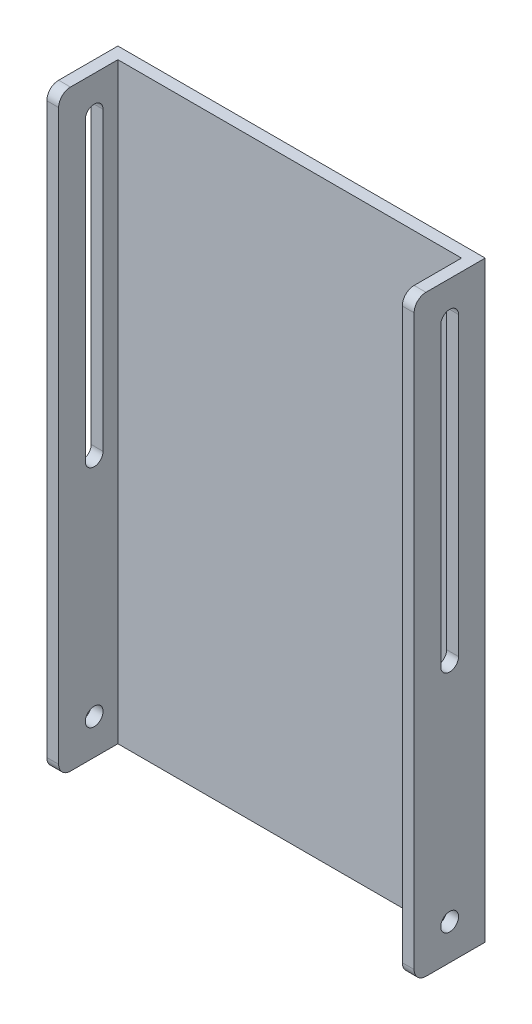
ISO-10303-21;
HEADER;
FILE_DESCRIPTION(('STEP AP214'),'2;1');
FILE_NAME('part.step','',(''),(''),'','','');
FILE_SCHEMA(('AUTOMOTIVE_DESIGN { 1 0 10303 214 1 1 1 1 }'));
ENDSEC;
DATA;
#1=APPLICATION_CONTEXT('core data for automotive mechanical design processes');
#2=APPLICATION_PROTOCOL_DEFINITION('international standard','automotive_design',2000,#1);
#3=PRODUCT_CONTEXT('',#1,'mechanical');
#4=PRODUCT('Part','Part','',(#3));
#5=PRODUCT_RELATED_PRODUCT_CATEGORY('part','',(#4));
#6=PRODUCT_DEFINITION_FORMATION('','',#4);
#7=PRODUCT_DEFINITION_CONTEXT('part definition',#1,'design');
#8=PRODUCT_DEFINITION('design','',#6,#7);
#9=PRODUCT_DEFINITION_SHAPE('','',#8);
#10=(LENGTH_UNIT() NAMED_UNIT(*) SI_UNIT(.MILLI.,.METRE.));
#11=(NAMED_UNIT(*) PLANE_ANGLE_UNIT() SI_UNIT($,.RADIAN.));
#12=(NAMED_UNIT(*) SI_UNIT($,.STERADIAN.) SOLID_ANGLE_UNIT());
#13=UNCERTAINTY_MEASURE_WITH_UNIT(LENGTH_MEASURE(1.E-05),#10,'distance_accuracy_value','');
#14=(GEOMETRIC_REPRESENTATION_CONTEXT(3) GLOBAL_UNCERTAINTY_ASSIGNED_CONTEXT((#13)) GLOBAL_UNIT_ASSIGNED_CONTEXT((#10,
#11,#12)) REPRESENTATION_CONTEXT('',''));
#15=CARTESIAN_POINT('',(0.,0.,0.));
#16=DIRECTION('',(0.,0.,1.));
#17=DIRECTION('',(1.,0.,0.));
#18=AXIS2_PLACEMENT_3D('',#15,#16,#17);
#19=CARTESIAN_POINT('',(0.,0.,10.));
#20=DIRECTION('',(0.,0.,-1.));
#21=DIRECTION('',(-1.,0.,0.));
#22=AXIS2_PLACEMENT_3D('',#19,#20,#21);
#23=PLANE('',#22);
#24=DIRECTION('',(-1.,0.,0.));
#25=VECTOR('',#24,1.);
#26=CARTESIAN_POINT('',(150.,250.,10.));
#27=LINE('',#26,#25);
#28=CARTESIAN_POINT('',(145.,250.,10.));
#29=VERTEX_POINT('',#28);
#30=CARTESIAN_POINT('',(-145.,250.,10.));
#31=VERTEX_POINT('',#30);
#32=EDGE_CURVE('E284',#29,#31,#27,.T.);
#33=ORIENTED_EDGE('',*,*,#32,.T.);
#34=DIRECTION('',(0.,-1.,0.));
#35=VECTOR('',#34,1.);
#36=CARTESIAN_POINT('',(-145.,0.,10.));
#37=LINE('',#36,#35);
#38=CARTESIAN_POINT('',(-145.,-250.,10.));
#39=VERTEX_POINT('',#38);
#40=EDGE_CURVE('E300',#31,#39,#37,.T.);
#41=ORIENTED_EDGE('',*,*,#40,.T.);
#42=DIRECTION('',(1.,0.,0.));
#43=VECTOR('',#42,1.);
#44=CARTESIAN_POINT('',(150.,-250.,10.));
#45=LINE('',#44,#43);
#46=CARTESIAN_POINT('',(145.,-250.,10.));
#47=VERTEX_POINT('',#46);
#48=EDGE_CURVE('E289',#39,#47,#45,.T.);
#49=ORIENTED_EDGE('',*,*,#48,.T.);
#50=DIRECTION('',(0.,-1.,0.));
#51=VECTOR('',#50,1.);
#52=CARTESIAN_POINT('',(145.,0.,10.));
#53=LINE('',#52,#51);
#54=EDGE_CURVE('E292',#29,#47,#53,.T.);
#55=ORIENTED_EDGE('',*,*,#54,.F.);
#56=EDGE_LOOP('',(#33,#41,#49,#55));
#57=FACE_BOUND('',#56,.T.);
#58=ADVANCED_FACE('F41',(#57),#23,.F.);
#59=CARTESIAN_POINT('',(150.,250.,10.));
#60=DIRECTION('',(0.,-1.,0.));
#61=DIRECTION('',(0.,0.,-1.));
#62=AXIS2_PLACEMENT_3D('',#59,#60,#61);
#63=PLANE('',#62);
#64=DIRECTION('',(0.,0.,-1.));
#65=VECTOR('',#64,1.);
#66=CARTESIAN_POINT('',(-155.,250.,0.));
#67=LINE('',#66,#65);
#68=CARTESIAN_POINT('',(-155.,250.,50.));
#69=VERTEX_POINT('',#68);
#70=CARTESIAN_POINT('',(-155.,250.,0.));
#71=VERTEX_POINT('',#70);
#72=EDGE_CURVE('E250',#69,#71,#67,.T.);
#73=ORIENTED_EDGE('',*,*,#72,.F.);
#74=DIRECTION('',(-1.,0.,0.));
#75=VECTOR('',#74,1.);
#76=CARTESIAN_POINT('',(150.,250.,50.));
#77=LINE('',#76,#75);
#78=CARTESIAN_POINT('',(-145.,250.,50.));
#79=VERTEX_POINT('',#78);
#80=EDGE_CURVE('E315',#69,#79,#77,.F.);
#81=ORIENTED_EDGE('',*,*,#80,.T.);
#82=DIRECTION('',(0.,0.,-1.));
#83=VECTOR('',#82,1.);
#84=CARTESIAN_POINT('',(-145.,250.,0.));
#85=LINE('',#84,#83);
#86=EDGE_CURVE('E252',#79,#31,#85,.T.);
#87=ORIENTED_EDGE('',*,*,#86,.T.);
#88=ORIENTED_EDGE('',*,*,#32,.F.);
#89=DIRECTION('',(0.,0.,-1.));
#90=VECTOR('',#89,1.);
#91=CARTESIAN_POINT('',(145.,250.,0.));
#92=LINE('',#91,#90);
#93=CARTESIAN_POINT('',(145.,250.,50.));
#94=VERTEX_POINT('',#93);
#95=EDGE_CURVE('E271',#94,#29,#92,.T.);
#96=ORIENTED_EDGE('',*,*,#95,.F.);
#97=DIRECTION('',(-1.,0.,0.));
#98=VECTOR('',#97,1.);
#99=CARTESIAN_POINT('',(150.,250.,50.));
#100=LINE('',#99,#98);
#101=CARTESIAN_POINT('',(155.,250.,50.));
#102=VERTEX_POINT('',#101);
#103=EDGE_CURVE('E309',#94,#102,#100,.F.);
#104=ORIENTED_EDGE('',*,*,#103,.T.);
#105=DIRECTION('',(0.,0.,-1.));
#106=VECTOR('',#105,1.);
#107=CARTESIAN_POINT('',(155.,250.,0.));
#108=LINE('',#107,#106);
#109=CARTESIAN_POINT('',(155.,250.,0.));
#110=VERTEX_POINT('',#109);
#111=EDGE_CURVE('E257',#102,#110,#108,.T.);
#112=ORIENTED_EDGE('',*,*,#111,.T.);
#113=DIRECTION('',(-1.,0.,0.));
#114=VECTOR('',#113,1.);
#115=CARTESIAN_POINT('',(150.,250.,0.));
#116=LINE('',#115,#114);
#117=EDGE_CURVE('E254',#110,#71,#116,.T.);
#118=ORIENTED_EDGE('',*,*,#117,.T.);
#119=EDGE_LOOP('',(#73,#81,#87,#88,#96,#104,#112,#118));
#120=FACE_BOUND('',#119,.T.);
#121=ADVANCED_FACE('F354',(#120),#63,.F.);
#122=CARTESIAN_POINT('',(150.,-250.,10.));
#123=DIRECTION('',(0.,1.,0.));
#124=DIRECTION('',(0.,0.,1.));
#125=AXIS2_PLACEMENT_3D('',#122,#123,#124);
#126=PLANE('',#125);
#127=DIRECTION('',(0.,0.,1.));
#128=VECTOR('',#127,1.);
#129=CARTESIAN_POINT('',(155.,-250.,0.));
#130=LINE('',#129,#128);
#131=CARTESIAN_POINT('',(155.,-250.,0.));
#132=VERTEX_POINT('',#131);
#133=CARTESIAN_POINT('',(155.,-250.,50.));
#134=VERTEX_POINT('',#133);
#135=EDGE_CURVE('E248',#132,#134,#130,.T.);
#136=ORIENTED_EDGE('',*,*,#135,.T.);
#137=DIRECTION('',(1.,0.,0.));
#138=VECTOR('',#137,1.);
#139=CARTESIAN_POINT('',(150.,-250.,50.));
#140=LINE('',#139,#138);
#141=CARTESIAN_POINT('',(145.,-250.,50.));
#142=VERTEX_POINT('',#141);
#143=EDGE_CURVE('E11',#134,#142,#140,.F.);
#144=ORIENTED_EDGE('',*,*,#143,.T.);
#145=DIRECTION('',(0.,0.,1.));
#146=VECTOR('',#145,1.);
#147=CARTESIAN_POINT('',(145.,-250.,0.));
#148=LINE('',#147,#146);
#149=EDGE_CURVE('E277',#47,#142,#148,.T.);
#150=ORIENTED_EDGE('',*,*,#149,.F.);
#151=ORIENTED_EDGE('',*,*,#48,.F.);
#152=DIRECTION('',(0.,0.,1.));
#153=VECTOR('',#152,1.);
#154=CARTESIAN_POINT('',(-145.,-250.,0.));
#155=LINE('',#154,#153);
#156=CARTESIAN_POINT('',(-145.,-250.,50.));
#157=VERTEX_POINT('',#156);
#158=EDGE_CURVE('E258',#39,#157,#155,.T.);
#159=ORIENTED_EDGE('',*,*,#158,.T.);
#160=DIRECTION('',(1.,0.,0.));
#161=VECTOR('',#160,1.);
#162=CARTESIAN_POINT('',(150.,-250.,50.));
#163=LINE('',#162,#161);
#164=CARTESIAN_POINT('',(-155.,-250.,50.));
#165=VERTEX_POINT('',#164);
#166=EDGE_CURVE('E47',#157,#165,#163,.F.);
#167=ORIENTED_EDGE('',*,*,#166,.T.);
#168=DIRECTION('',(0.,0.,1.));
#169=VECTOR('',#168,1.);
#170=CARTESIAN_POINT('',(-155.,-250.,0.));
#171=LINE('',#170,#169);
#172=CARTESIAN_POINT('',(-155.,-250.,0.));
#173=VERTEX_POINT('',#172);
#174=EDGE_CURVE('E259',#173,#165,#171,.T.);
#175=ORIENTED_EDGE('',*,*,#174,.F.);
#176=DIRECTION('',(1.,0.,0.));
#177=VECTOR('',#176,1.);
#178=CARTESIAN_POINT('',(150.,-250.,0.));
#179=LINE('',#178,#177);
#180=EDGE_CURVE('E288',#173,#132,#179,.T.);
#181=ORIENTED_EDGE('',*,*,#180,.T.);
#182=EDGE_LOOP('',(#136,#144,#150,#151,#159,#167,#175,#181));
#183=FACE_BOUND('',#182,.T.);
#184=ADVANCED_FACE('F335',(#183),#126,.F.);
#185=CARTESIAN_POINT('',(0.,0.,0.));
#186=DIRECTION('',(0.,0.,-1.));
#187=DIRECTION('',(-1.,0.,0.));
#188=AXIS2_PLACEMENT_3D('',#185,#186,#187);
#189=PLANE('',#188);
#190=DIRECTION('',(0.,-1.,0.));
#191=VECTOR('',#190,1.);
#192=CARTESIAN_POINT('',(155.,310.827625302982,0.));
#193=LINE('',#192,#191);
#194=EDGE_CURVE('E272',#110,#132,#193,.T.);
#195=ORIENTED_EDGE('',*,*,#194,.T.);
#196=ORIENTED_EDGE('',*,*,#180,.F.);
#197=DIRECTION('',(0.,-1.,0.));
#198=VECTOR('',#197,1.);
#199=CARTESIAN_POINT('',(-155.,310.827625302982,0.));
#200=LINE('',#199,#198);
#201=EDGE_CURVE('E251',#71,#173,#200,.T.);
#202=ORIENTED_EDGE('',*,*,#201,.F.);
#203=ORIENTED_EDGE('',*,*,#117,.F.);
#204=EDGE_LOOP('',(#195,#196,#202,#203));
#205=FACE_BOUND('',#204,.T.);
#206=ADVANCED_FACE('F360',(#205),#189,.T.);
#207=CARTESIAN_POINT('',(145.,310.827625302982,0.));
#208=DIRECTION('',(1.,0.,0.));
#209=DIRECTION('',(0.,0.,-1.));
#210=AXIS2_PLACEMENT_3D('',#207,#208,#209);
#211=PLANE('',#210);
#212=CARTESIAN_POINT('',(145.,-220.,30.));
#213=DIRECTION('',(1.,0.,0.));
#214=DIRECTION('',(0.,0.,-1.));
#215=AXIS2_PLACEMENT_3D('',#212,#213,#214);
#216=CIRCLE('',#215,7.50000000000001);
#217=CARTESIAN_POINT('',(145.,-220.,22.5));
#218=VERTEX_POINT('',#217);
#219=EDGE_CURVE('E246',#218,#218,#216,.T.);
#220=ORIENTED_EDGE('',*,*,#219,.T.);
#221=EDGE_LOOP('',(#220));
#222=FACE_BOUND('',#221,.T.);
#223=DIRECTION('',(0.,-1.,0.));
#224=VECTOR('',#223,1.);
#225=CARTESIAN_POINT('',(145.,310.827625302982,37.5));
#226=LINE('',#225,#224);
#227=CARTESIAN_POINT('',(145.,220.,37.5));
#228=VERTEX_POINT('',#227);
#229=CARTESIAN_POINT('',(145.,-30.,37.5));
#230=VERTEX_POINT('',#229);
#231=EDGE_CURVE('E240',#228,#230,#226,.T.);
#232=ORIENTED_EDGE('',*,*,#231,.T.);
#233=CARTESIAN_POINT('',(145.,-30.,30.));
#234=DIRECTION('',(1.,0.,0.));
#235=DIRECTION('',(0.,0.,-1.));
#236=AXIS2_PLACEMENT_3D('',#233,#234,#235);
#237=CIRCLE('',#236,7.5);
#238=CARTESIAN_POINT('',(145.,-30.,22.5));
#239=VERTEX_POINT('',#238);
#240=EDGE_CURVE('E183',#230,#239,#237,.T.);
#241=ORIENTED_EDGE('',*,*,#240,.T.);
#242=DIRECTION('',(0.,1.,0.));
#243=VECTOR('',#242,1.);
#244=CARTESIAN_POINT('',(145.,310.827625302982,22.5));
#245=LINE('',#244,#243);
#246=CARTESIAN_POINT('',(145.,220.,22.5));
#247=VERTEX_POINT('',#246);
#248=EDGE_CURVE('E230',#239,#247,#245,.T.);
#249=ORIENTED_EDGE('',*,*,#248,.T.);
#250=CARTESIAN_POINT('',(145.,220.,30.));
#251=DIRECTION('',(1.,0.,0.));
#252=DIRECTION('',(0.,0.,-1.));
#253=AXIS2_PLACEMENT_3D('',#250,#251,#252);
#254=CIRCLE('',#253,7.5);
#255=EDGE_CURVE('E232',#247,#228,#254,.T.);
#256=ORIENTED_EDGE('',*,*,#255,.T.);
#257=EDGE_LOOP('',(#232,#241,#249,#256));
#258=FACE_BOUND('',#257,.T.);
#259=DIRECTION('',(0.,-1.,0.));
#260=VECTOR('',#259,1.);
#261=CARTESIAN_POINT('',(145.,310.827625302982,60.));
#262=LINE('',#261,#260);
#263=CARTESIAN_POINT('',(145.,240.,60.));
#264=VERTEX_POINT('',#263);
#265=CARTESIAN_POINT('',(145.,-240.,60.));
#266=VERTEX_POINT('',#265);
#267=EDGE_CURVE('E283',#264,#266,#262,.T.);
#268=ORIENTED_EDGE('',*,*,#267,.F.);
#269=CARTESIAN_POINT('',(145.,240.,50.));
#270=DIRECTION('',(1.,0.,0.));
#271=DIRECTION('',(0.,0.,-1.));
#272=AXIS2_PLACEMENT_3D('',#269,#270,#271);
#273=CIRCLE('',#272,10.);
#274=EDGE_CURVE('E326',#264,#94,#273,.F.);
#275=ORIENTED_EDGE('',*,*,#274,.T.);
#276=ORIENTED_EDGE('',*,*,#95,.T.);
#277=ORIENTED_EDGE('',*,*,#54,.T.);
#278=ORIENTED_EDGE('',*,*,#149,.T.);
#279=CARTESIAN_POINT('',(145.,-240.,50.));
#280=DIRECTION('',(1.,0.,0.));
#281=DIRECTION('',(0.,0.,-1.));
#282=AXIS2_PLACEMENT_3D('',#279,#280,#281);
#283=CIRCLE('',#282,10.);
#284=EDGE_CURVE('E322',#142,#266,#283,.F.);
#285=ORIENTED_EDGE('',*,*,#284,.T.);
#286=EDGE_LOOP('',(#268,#275,#276,#277,#278,#285));
#287=FACE_BOUND('',#286,.T.);
#288=ADVANCED_FACE('F370',(#222,#258,#287),#211,.F.);
#289=CARTESIAN_POINT('',(145.,310.827625302982,60.));
#290=DIRECTION('',(0.,0.,-1.));
#291=DIRECTION('',(-1.,0.,0.));
#292=AXIS2_PLACEMENT_3D('',#289,#290,#291);
#293=PLANE('',#292);
#294=DIRECTION('',(0.,-1.,0.));
#295=VECTOR('',#294,1.);
#296=CARTESIAN_POINT('',(155.,310.827625302982,60.));
#297=LINE('',#296,#295);
#298=CARTESIAN_POINT('',(155.,240.,60.));
#299=VERTEX_POINT('',#298);
#300=CARTESIAN_POINT('',(155.,-240.,60.));
#301=VERTEX_POINT('',#300);
#302=EDGE_CURVE('E279',#299,#301,#297,.T.);
#303=ORIENTED_EDGE('',*,*,#302,.F.);
#304=DIRECTION('',(-1.,0.,0.));
#305=VECTOR('',#304,1.);
#306=CARTESIAN_POINT('',(145.,240.,60.));
#307=LINE('',#306,#305);
#308=EDGE_CURVE('E321',#299,#264,#307,.T.);
#309=ORIENTED_EDGE('',*,*,#308,.T.);
#310=ORIENTED_EDGE('',*,*,#267,.T.);
#311=DIRECTION('',(1.,0.,0.));
#312=VECTOR('',#311,1.);
#313=CARTESIAN_POINT('',(145.,-240.,60.));
#314=LINE('',#313,#312);
#315=EDGE_CURVE('E318',#266,#301,#314,.T.);
#316=ORIENTED_EDGE('',*,*,#315,.T.);
#317=EDGE_LOOP('',(#303,#309,#310,#316));
#318=FACE_BOUND('',#317,.T.);
#319=ADVANCED_FACE('F367',(#318),#293,.F.);
#320=CARTESIAN_POINT('',(155.,310.827625302982,0.));
#321=DIRECTION('',(1.,0.,0.));
#322=DIRECTION('',(0.,0.,-1.));
#323=AXIS2_PLACEMENT_3D('',#320,#321,#322);
#324=PLANE('',#323);
#325=CARTESIAN_POINT('',(155.,-220.,30.));
#326=DIRECTION('',(1.,0.,0.));
#327=DIRECTION('',(0.,0.,-1.));
#328=AXIS2_PLACEMENT_3D('',#325,#326,#327);
#329=CIRCLE('',#328,7.50000000000001);
#330=CARTESIAN_POINT('',(155.,-220.,22.5));
#331=VERTEX_POINT('',#330);
#332=EDGE_CURVE('E202',#331,#331,#329,.T.);
#333=ORIENTED_EDGE('',*,*,#332,.F.);
#334=EDGE_LOOP('',(#333));
#335=FACE_BOUND('',#334,.T.);
#336=CARTESIAN_POINT('',(155.,-30.,30.));
#337=DIRECTION('',(1.,0.,0.));
#338=DIRECTION('',(0.,0.,-1.));
#339=AXIS2_PLACEMENT_3D('',#336,#337,#338);
#340=CIRCLE('',#339,7.5);
#341=CARTESIAN_POINT('',(155.,-30.,37.5));
#342=VERTEX_POINT('',#341);
#343=CARTESIAN_POINT('',(155.,-30.,22.5));
#344=VERTEX_POINT('',#343);
#345=EDGE_CURVE('E185',#342,#344,#340,.T.);
#346=ORIENTED_EDGE('',*,*,#345,.F.);
#347=DIRECTION('',(0.,-1.,0.));
#348=VECTOR('',#347,1.);
#349=CARTESIAN_POINT('',(155.,-30.,37.5));
#350=LINE('',#349,#348);
#351=CARTESIAN_POINT('',(155.,220.,37.5));
#352=VERTEX_POINT('',#351);
#353=EDGE_CURVE('E191',#352,#342,#350,.T.);
#354=ORIENTED_EDGE('',*,*,#353,.F.);
#355=CARTESIAN_POINT('',(155.,220.,30.));
#356=DIRECTION('',(1.,0.,0.));
#357=DIRECTION('',(0.,0.,-1.));
#358=AXIS2_PLACEMENT_3D('',#355,#356,#357);
#359=CIRCLE('',#358,7.5);
#360=CARTESIAN_POINT('',(155.,220.,22.5));
#361=VERTEX_POINT('',#360);
#362=EDGE_CURVE('E196',#361,#352,#359,.T.);
#363=ORIENTED_EDGE('',*,*,#362,.F.);
#364=DIRECTION('',(0.,1.,0.));
#365=VECTOR('',#364,1.);
#366=CARTESIAN_POINT('',(155.,-30.,22.5));
#367=LINE('',#366,#365);
#368=EDGE_CURVE('E204',#344,#361,#367,.T.);
#369=ORIENTED_EDGE('',*,*,#368,.F.);
#370=EDGE_LOOP('',(#346,#354,#363,#369));
#371=FACE_BOUND('',#370,.T.);
#372=ORIENTED_EDGE('',*,*,#111,.F.);
#373=CARTESIAN_POINT('',(155.,240.,50.));
#374=DIRECTION('',(1.,0.,0.));
#375=DIRECTION('',(0.,0.,-1.));
#376=AXIS2_PLACEMENT_3D('',#373,#374,#375);
#377=CIRCLE('',#376,10.);
#378=EDGE_CURVE('E328',#102,#299,#377,.T.);
#379=ORIENTED_EDGE('',*,*,#378,.T.);
#380=ORIENTED_EDGE('',*,*,#302,.T.);
#381=CARTESIAN_POINT('',(155.,-240.,50.));
#382=DIRECTION('',(1.,0.,0.));
#383=DIRECTION('',(0.,0.,-1.));
#384=AXIS2_PLACEMENT_3D('',#381,#382,#383);
#385=CIRCLE('',#384,10.);
#386=EDGE_CURVE('E57',#301,#134,#385,.T.);
#387=ORIENTED_EDGE('',*,*,#386,.T.);
#388=ORIENTED_EDGE('',*,*,#135,.F.);
#389=ORIENTED_EDGE('',*,*,#194,.F.);
#390=EDGE_LOOP('',(#372,#379,#380,#387,#388,#389));
#391=FACE_BOUND('',#390,.T.);
#392=ADVANCED_FACE('F205',(#335,#371,#391),#324,.T.);
#393=CARTESIAN_POINT('',(-145.,310.827625302982,0.));
#394=DIRECTION('',(1.,0.,0.));
#395=DIRECTION('',(0.,0.,-1.));
#396=AXIS2_PLACEMENT_3D('',#393,#394,#395);
#397=PLANE('',#396);
#398=CARTESIAN_POINT('',(-145.,-220.,30.));
#399=DIRECTION('',(1.,0.,0.));
#400=DIRECTION('',(0.,0.,-1.));
#401=AXIS2_PLACEMENT_3D('',#398,#399,#400);
#402=CIRCLE('',#401,7.50000000000001);
#403=CARTESIAN_POINT('',(-145.,-220.,22.5));
#404=VERTEX_POINT('',#403);
#405=EDGE_CURVE('E241',#404,#404,#402,.T.);
#406=ORIENTED_EDGE('',*,*,#405,.F.);
#407=EDGE_LOOP('',(#406));
#408=FACE_BOUND('',#407,.T.);
#409=CARTESIAN_POINT('',(-145.,-30.,30.));
#410=DIRECTION('',(1.,0.,0.));
#411=DIRECTION('',(0.,0.,-1.));
#412=AXIS2_PLACEMENT_3D('',#409,#410,#411);
#413=CIRCLE('',#412,7.5);
#414=CARTESIAN_POINT('',(-145.,-30.,37.5));
#415=VERTEX_POINT('',#414);
#416=CARTESIAN_POINT('',(-145.,-30.,22.5));
#417=VERTEX_POINT('',#416);
#418=EDGE_CURVE('E239',#415,#417,#413,.T.);
#419=ORIENTED_EDGE('',*,*,#418,.F.);
#420=DIRECTION('',(0.,-1.,0.));
#421=VECTOR('',#420,1.);
#422=CARTESIAN_POINT('',(-145.,310.827625302982,37.5));
#423=LINE('',#422,#421);
#424=CARTESIAN_POINT('',(-145.,220.,37.5));
#425=VERTEX_POINT('',#424);
#426=EDGE_CURVE('E235',#425,#415,#423,.T.);
#427=ORIENTED_EDGE('',*,*,#426,.F.);
#428=CARTESIAN_POINT('',(-145.,220.,30.));
#429=DIRECTION('',(1.,0.,0.));
#430=DIRECTION('',(0.,0.,-1.));
#431=AXIS2_PLACEMENT_3D('',#428,#429,#430);
#432=CIRCLE('',#431,7.5);
#433=CARTESIAN_POINT('',(-145.,220.,22.5));
#434=VERTEX_POINT('',#433);
#435=EDGE_CURVE('E229',#434,#425,#432,.T.);
#436=ORIENTED_EDGE('',*,*,#435,.F.);
#437=DIRECTION('',(0.,1.,0.));
#438=VECTOR('',#437,1.);
#439=CARTESIAN_POINT('',(-145.,310.827625302982,22.5));
#440=LINE('',#439,#438);
#441=EDGE_CURVE('E223',#417,#434,#440,.T.);
#442=ORIENTED_EDGE('',*,*,#441,.F.);
#443=EDGE_LOOP('',(#419,#427,#436,#442));
#444=FACE_BOUND('',#443,.T.);
#445=ORIENTED_EDGE('',*,*,#86,.F.);
#446=CARTESIAN_POINT('',(-145.,240.,50.));
#447=DIRECTION('',(1.,0.,0.));
#448=DIRECTION('',(0.,0.,-1.));
#449=AXIS2_PLACEMENT_3D('',#446,#447,#448);
#450=CIRCLE('',#449,10.);
#451=CARTESIAN_POINT('',(-145.,240.,60.));
#452=VERTEX_POINT('',#451);
#453=EDGE_CURVE('E316',#79,#452,#450,.T.);
#454=ORIENTED_EDGE('',*,*,#453,.T.);
#455=DIRECTION('',(0.,-1.,0.));
#456=VECTOR('',#455,1.);
#457=CARTESIAN_POINT('',(-145.,310.827625302982,60.));
#458=LINE('',#457,#456);
#459=CARTESIAN_POINT('',(-145.,-240.,60.));
#460=VERTEX_POINT('',#459);
#461=EDGE_CURVE('E263',#452,#460,#458,.T.);
#462=ORIENTED_EDGE('',*,*,#461,.T.);
#463=CARTESIAN_POINT('',(-145.,-240.,50.));
#464=DIRECTION('',(1.,0.,0.));
#465=DIRECTION('',(0.,0.,-1.));
#466=AXIS2_PLACEMENT_3D('',#463,#464,#465);
#467=CIRCLE('',#466,10.);
#468=EDGE_CURVE('E314',#460,#157,#467,.T.);
#469=ORIENTED_EDGE('',*,*,#468,.T.);
#470=ORIENTED_EDGE('',*,*,#158,.F.);
#471=ORIENTED_EDGE('',*,*,#40,.F.);
#472=EDGE_LOOP('',(#445,#454,#462,#469,#470,#471));
#473=FACE_BOUND('',#472,.T.);
#474=ADVANCED_FACE('F350',(#408,#444,#473),#397,.T.);
#475=CARTESIAN_POINT('',(-155.,310.827625302982,60.));
#476=DIRECTION('',(0.,0.,-1.));
#477=DIRECTION('',(-1.,0.,0.));
#478=AXIS2_PLACEMENT_3D('',#475,#476,#477);
#479=PLANE('',#478);
#480=ORIENTED_EDGE('',*,*,#461,.F.);
#481=DIRECTION('',(-1.,0.,0.));
#482=VECTOR('',#481,1.);
#483=CARTESIAN_POINT('',(-155.,240.,60.));
#484=LINE('',#483,#482);
#485=CARTESIAN_POINT('',(-155.,240.,60.));
#486=VERTEX_POINT('',#485);
#487=EDGE_CURVE('E304',#452,#486,#484,.T.);
#488=ORIENTED_EDGE('',*,*,#487,.T.);
#489=DIRECTION('',(0.,-1.,0.));
#490=VECTOR('',#489,1.);
#491=CARTESIAN_POINT('',(-155.,310.827625302982,60.));
#492=LINE('',#491,#490);
#493=CARTESIAN_POINT('',(-155.,-240.,60.));
#494=VERTEX_POINT('',#493);
#495=EDGE_CURVE('E266',#486,#494,#492,.T.);
#496=ORIENTED_EDGE('',*,*,#495,.T.);
#497=DIRECTION('',(1.,0.,0.));
#498=VECTOR('',#497,1.);
#499=CARTESIAN_POINT('',(-155.,-240.,60.));
#500=LINE('',#499,#498);
#501=EDGE_CURVE('E299',#494,#460,#500,.T.);
#502=ORIENTED_EDGE('',*,*,#501,.T.);
#503=EDGE_LOOP('',(#480,#488,#496,#502));
#504=FACE_BOUND('',#503,.T.);
#505=ADVANCED_FACE('F344',(#504),#479,.F.);
#506=CARTESIAN_POINT('',(-155.,310.827625302982,0.));
#507=DIRECTION('',(1.,0.,0.));
#508=DIRECTION('',(0.,0.,-1.));
#509=AXIS2_PLACEMENT_3D('',#506,#507,#508);
#510=PLANE('',#509);
#511=CARTESIAN_POINT('',(-155.,-220.,30.));
#512=DIRECTION('',(1.,0.,0.));
#513=DIRECTION('',(0.,0.,-1.));
#514=AXIS2_PLACEMENT_3D('',#511,#512,#513);
#515=CIRCLE('',#514,7.50000000000001);
#516=CARTESIAN_POINT('',(-155.,-220.,22.5));
#517=VERTEX_POINT('',#516);
#518=EDGE_CURVE('E208',#517,#517,#515,.T.);
#519=ORIENTED_EDGE('',*,*,#518,.T.);
#520=EDGE_LOOP('',(#519));
#521=FACE_BOUND('',#520,.T.);
#522=DIRECTION('',(0.,-1.,0.));
#523=VECTOR('',#522,1.);
#524=CARTESIAN_POINT('',(-155.,-30.,37.5));
#525=LINE('',#524,#523);
#526=CARTESIAN_POINT('',(-155.,220.,37.5));
#527=VERTEX_POINT('',#526);
#528=CARTESIAN_POINT('',(-155.,-30.,37.5));
#529=VERTEX_POINT('',#528);
#530=EDGE_CURVE('E213',#527,#529,#525,.T.);
#531=ORIENTED_EDGE('',*,*,#530,.T.);
#532=CARTESIAN_POINT('',(-155.,-30.,30.));
#533=DIRECTION('',(1.,0.,0.));
#534=DIRECTION('',(0.,0.,-1.));
#535=AXIS2_PLACEMENT_3D('',#532,#533,#534);
#536=CIRCLE('',#535,7.5);
#537=CARTESIAN_POINT('',(-155.,-30.,22.5));
#538=VERTEX_POINT('',#537);
#539=EDGE_CURVE('E200',#529,#538,#536,.T.);
#540=ORIENTED_EDGE('',*,*,#539,.T.);
#541=DIRECTION('',(0.,1.,0.));
#542=VECTOR('',#541,1.);
#543=CARTESIAN_POINT('',(-155.,-30.,22.5));
#544=LINE('',#543,#542);
#545=CARTESIAN_POINT('',(-155.,220.,22.5));
#546=VERTEX_POINT('',#545);
#547=EDGE_CURVE('E219',#538,#546,#544,.T.);
#548=ORIENTED_EDGE('',*,*,#547,.T.);
#549=CARTESIAN_POINT('',(-155.,220.,30.));
#550=DIRECTION('',(1.,0.,0.));
#551=DIRECTION('',(0.,0.,-1.));
#552=AXIS2_PLACEMENT_3D('',#549,#550,#551);
#553=CIRCLE('',#552,7.5);
#554=EDGE_CURVE('E216',#546,#527,#553,.T.);
#555=ORIENTED_EDGE('',*,*,#554,.T.);
#556=EDGE_LOOP('',(#531,#540,#548,#555));
#557=FACE_BOUND('',#556,.T.);
#558=ORIENTED_EDGE('',*,*,#495,.F.);
#559=CARTESIAN_POINT('',(-155.,240.,50.));
#560=DIRECTION('',(1.,0.,0.));
#561=DIRECTION('',(0.,0.,-1.));
#562=AXIS2_PLACEMENT_3D('',#559,#560,#561);
#563=CIRCLE('',#562,10.);
#564=EDGE_CURVE('E306',#486,#69,#563,.F.);
#565=ORIENTED_EDGE('',*,*,#564,.T.);
#566=ORIENTED_EDGE('',*,*,#72,.T.);
#567=ORIENTED_EDGE('',*,*,#201,.T.);
#568=ORIENTED_EDGE('',*,*,#174,.T.);
#569=CARTESIAN_POINT('',(-155.,-240.,50.));
#570=DIRECTION('',(1.,0.,0.));
#571=DIRECTION('',(0.,0.,-1.));
#572=AXIS2_PLACEMENT_3D('',#569,#570,#571);
#573=CIRCLE('',#572,10.);
#574=EDGE_CURVE('E308',#165,#494,#573,.F.);
#575=ORIENTED_EDGE('',*,*,#574,.T.);
#576=EDGE_LOOP('',(#558,#565,#566,#567,#568,#575));
#577=FACE_BOUND('',#576,.T.);
#578=ADVANCED_FACE('F336',(#521,#557,#577),#510,.F.);
#579=CARTESIAN_POINT('',(-155.,-30.,22.5));
#580=DIRECTION('',(0.,0.,-1.));
#581=DIRECTION('',(-1.,0.,0.));
#582=AXIS2_PLACEMENT_3D('',#579,#580,#581);
#583=PLANE('',#582);
#584=ORIENTED_EDGE('',*,*,#441,.T.);
#585=DIRECTION('',(1.,0.,0.));
#586=VECTOR('',#585,1.);
#587=CARTESIAN_POINT('',(-155.,220.,22.5));
#588=LINE('',#587,#586);
#589=EDGE_CURVE('E607',#546,#434,#588,.T.);
#590=ORIENTED_EDGE('',*,*,#589,.F.);
#591=ORIENTED_EDGE('',*,*,#547,.F.);
#592=DIRECTION('',(1.,0.,0.));
#593=VECTOR('',#592,1.);
#594=CARTESIAN_POINT('',(-155.,-30.,22.5));
#595=LINE('',#594,#593);
#596=EDGE_CURVE('E220',#538,#417,#595,.T.);
#597=ORIENTED_EDGE('',*,*,#596,.T.);
#598=EDGE_LOOP('',(#584,#590,#591,#597));
#599=FACE_BOUND('',#598,.T.);
#600=ADVANCED_FACE('F441',(#599),#583,.F.);
#601=CARTESIAN_POINT('',(-155.,220.,30.));
#602=DIRECTION('',(1.,0.,0.));
#603=DIRECTION('',(0.,0.,-1.));
#604=AXIS2_PLACEMENT_3D('',#601,#602,#603);
#605=CYLINDRICAL_SURFACE('',#604,7.5);
#606=ORIENTED_EDGE('',*,*,#435,.T.);
#607=DIRECTION('',(1.,0.,0.));
#608=VECTOR('',#607,1.);
#609=CARTESIAN_POINT('',(-155.,220.,37.5));
#610=LINE('',#609,#608);
#611=EDGE_CURVE('E599',#527,#425,#610,.T.);
#612=ORIENTED_EDGE('',*,*,#611,.F.);
#613=ORIENTED_EDGE('',*,*,#554,.F.);
#614=ORIENTED_EDGE('',*,*,#589,.T.);
#615=EDGE_LOOP('',(#606,#612,#613,#614));
#616=FACE_BOUND('',#615,.T.);
#617=ADVANCED_FACE('F453',(#616),#605,.F.);
#618=CARTESIAN_POINT('',(-155.,-30.,37.5));
#619=DIRECTION('',(0.,0.,1.));
#620=DIRECTION('',(1.,0.,0.));
#621=AXIS2_PLACEMENT_3D('',#618,#619,#620);
#622=PLANE('',#621);
#623=ORIENTED_EDGE('',*,*,#426,.T.);
#624=DIRECTION('',(1.,0.,0.));
#625=VECTOR('',#624,1.);
#626=CARTESIAN_POINT('',(-155.,-30.,37.5));
#627=LINE('',#626,#625);
#628=EDGE_CURVE('E186',#529,#415,#627,.T.);
#629=ORIENTED_EDGE('',*,*,#628,.F.);
#630=ORIENTED_EDGE('',*,*,#530,.F.);
#631=ORIENTED_EDGE('',*,*,#611,.T.);
#632=EDGE_LOOP('',(#623,#629,#630,#631));
#633=FACE_BOUND('',#632,.T.);
#634=ADVANCED_FACE('F461',(#633),#622,.F.);
#635=CARTESIAN_POINT('',(-155.,-30.,30.));
#636=DIRECTION('',(1.,0.,0.));
#637=DIRECTION('',(0.,0.,-1.));
#638=AXIS2_PLACEMENT_3D('',#635,#636,#637);
#639=CYLINDRICAL_SURFACE('',#638,7.5);
#640=ORIENTED_EDGE('',*,*,#418,.T.);
#641=ORIENTED_EDGE('',*,*,#596,.F.);
#642=ORIENTED_EDGE('',*,*,#539,.F.);
#643=ORIENTED_EDGE('',*,*,#628,.T.);
#644=EDGE_LOOP('',(#640,#641,#642,#643));
#645=FACE_BOUND('',#644,.T.);
#646=ADVANCED_FACE('F472',(#645),#639,.F.);
#647=CARTESIAN_POINT('',(-155.,-220.,30.));
#648=DIRECTION('',(1.,0.,0.));
#649=DIRECTION('',(0.,0.,-1.));
#650=AXIS2_PLACEMENT_3D('',#647,#648,#649);
#651=CYLINDRICAL_SURFACE('',#650,7.50000000000001);
#652=ORIENTED_EDGE('',*,*,#405,.T.);
#653=EDGE_LOOP('',(#652));
#654=FACE_BOUND('',#653,.T.);
#655=ORIENTED_EDGE('',*,*,#518,.F.);
#656=EDGE_LOOP('',(#655));
#657=FACE_BOUND('',#656,.T.);
#658=ADVANCED_FACE('F433',(#654,#657),#651,.F.);
#659=EDGE_CURVE('E177',#230,#342,#627,.T.);
#660=ORIENTED_EDGE('',*,*,#659,.T.);
#661=ORIENTED_EDGE('',*,*,#345,.T.);
#662=EDGE_CURVE('E606',#239,#344,#595,.T.);
#663=ORIENTED_EDGE('',*,*,#662,.F.);
#664=ORIENTED_EDGE('',*,*,#240,.F.);
#665=EDGE_LOOP('',(#660,#661,#663,#664));
#666=FACE_BOUND('',#665,.T.);
#667=ADVANCED_FACE('F178',(#666),#639,.F.);
#668=EDGE_CURVE('E193',#228,#352,#610,.T.);
#669=ORIENTED_EDGE('',*,*,#668,.T.);
#670=ORIENTED_EDGE('',*,*,#353,.T.);
#671=ORIENTED_EDGE('',*,*,#659,.F.);
#672=ORIENTED_EDGE('',*,*,#231,.F.);
#673=EDGE_LOOP('',(#669,#670,#671,#672));
#674=FACE_BOUND('',#673,.T.);
#675=ADVANCED_FACE('F192',(#674),#622,.F.);
#676=EDGE_CURVE('E602',#247,#361,#588,.T.);
#677=ORIENTED_EDGE('',*,*,#676,.T.);
#678=ORIENTED_EDGE('',*,*,#362,.T.);
#679=ORIENTED_EDGE('',*,*,#668,.F.);
#680=ORIENTED_EDGE('',*,*,#255,.F.);
#681=EDGE_LOOP('',(#677,#678,#679,#680));
#682=FACE_BOUND('',#681,.T.);
#683=ADVANCED_FACE('F442',(#682),#605,.F.);
#684=ORIENTED_EDGE('',*,*,#662,.T.);
#685=ORIENTED_EDGE('',*,*,#368,.T.);
#686=ORIENTED_EDGE('',*,*,#676,.F.);
#687=ORIENTED_EDGE('',*,*,#248,.F.);
#688=EDGE_LOOP('',(#684,#685,#686,#687));
#689=FACE_BOUND('',#688,.T.);
#690=ADVANCED_FACE('F429',(#689),#583,.F.);
#691=ORIENTED_EDGE('',*,*,#332,.T.);
#692=EDGE_LOOP('',(#691));
#693=FACE_BOUND('',#692,.T.);
#694=ORIENTED_EDGE('',*,*,#219,.F.);
#695=EDGE_LOOP('',(#694));
#696=FACE_BOUND('',#695,.T.);
#697=ADVANCED_FACE('F394',(#693,#696),#651,.F.);
#698=CARTESIAN_POINT('',(-155.,240.,50.));
#699=DIRECTION('',(-1.,0.,0.));
#700=DIRECTION('',(0.,0.,1.));
#701=AXIS2_PLACEMENT_3D('',#698,#699,#700);
#702=CYLINDRICAL_SURFACE('',#701,10.);
#703=ORIENTED_EDGE('',*,*,#453,.F.);
#704=ORIENTED_EDGE('',*,*,#80,.F.);
#705=ORIENTED_EDGE('',*,*,#564,.F.);
#706=ORIENTED_EDGE('',*,*,#487,.F.);
#707=EDGE_LOOP('',(#703,#704,#705,#706));
#708=FACE_BOUND('',#707,.T.);
#709=ADVANCED_FACE('F355',(#708),#702,.T.);
#710=CARTESIAN_POINT('',(145.,240.,50.));
#711=DIRECTION('',(-1.,0.,0.));
#712=DIRECTION('',(0.,0.,1.));
#713=AXIS2_PLACEMENT_3D('',#710,#711,#712);
#714=CYLINDRICAL_SURFACE('',#713,10.);
#715=ORIENTED_EDGE('',*,*,#378,.F.);
#716=ORIENTED_EDGE('',*,*,#103,.F.);
#717=ORIENTED_EDGE('',*,*,#274,.F.);
#718=ORIENTED_EDGE('',*,*,#308,.F.);
#719=EDGE_LOOP('',(#715,#716,#717,#718));
#720=FACE_BOUND('',#719,.T.);
#721=ADVANCED_FACE('F372',(#720),#714,.T.);
#722=CARTESIAN_POINT('',(145.,-240.,50.));
#723=DIRECTION('',(1.,0.,0.));
#724=DIRECTION('',(0.,0.,-1.));
#725=AXIS2_PLACEMENT_3D('',#722,#723,#724);
#726=CYLINDRICAL_SURFACE('',#725,10.);
#727=ORIENTED_EDGE('',*,*,#284,.F.);
#728=ORIENTED_EDGE('',*,*,#143,.F.);
#729=ORIENTED_EDGE('',*,*,#386,.F.);
#730=ORIENTED_EDGE('',*,*,#315,.F.);
#731=EDGE_LOOP('',(#727,#728,#729,#730));
#732=FACE_BOUND('',#731,.T.);
#733=ADVANCED_FACE('F361',(#732),#726,.T.);
#734=CARTESIAN_POINT('',(-155.,-240.,50.));
#735=DIRECTION('',(1.,0.,0.));
#736=DIRECTION('',(0.,0.,-1.));
#737=AXIS2_PLACEMENT_3D('',#734,#735,#736);
#738=CYLINDRICAL_SURFACE('',#737,10.);
#739=ORIENTED_EDGE('',*,*,#574,.F.);
#740=ORIENTED_EDGE('',*,*,#166,.F.);
#741=ORIENTED_EDGE('',*,*,#468,.F.);
#742=ORIENTED_EDGE('',*,*,#501,.F.);
#743=EDGE_LOOP('',(#739,#740,#741,#742));
#744=FACE_BOUND('',#743,.T.);
#745=ADVANCED_FACE('F43',(#744),#738,.T.);
#746=CLOSED_SHELL('',(#58,#121,#184,#206,#288,#319,#392,#474,#505,#578,#600,#617,#634,#646,#658,
#667,#675,#683,#690,#697,#709,#721,#733,#745));
#747=MANIFOLD_SOLID_BREP('B2',#746);
#748=ADVANCED_BREP_SHAPE_REPRESENTATION('',(#18,#747),#14);
#749=SHAPE_DEFINITION_REPRESENTATION(#9,#748);
ENDSEC;
END-ISO-10303-21;
